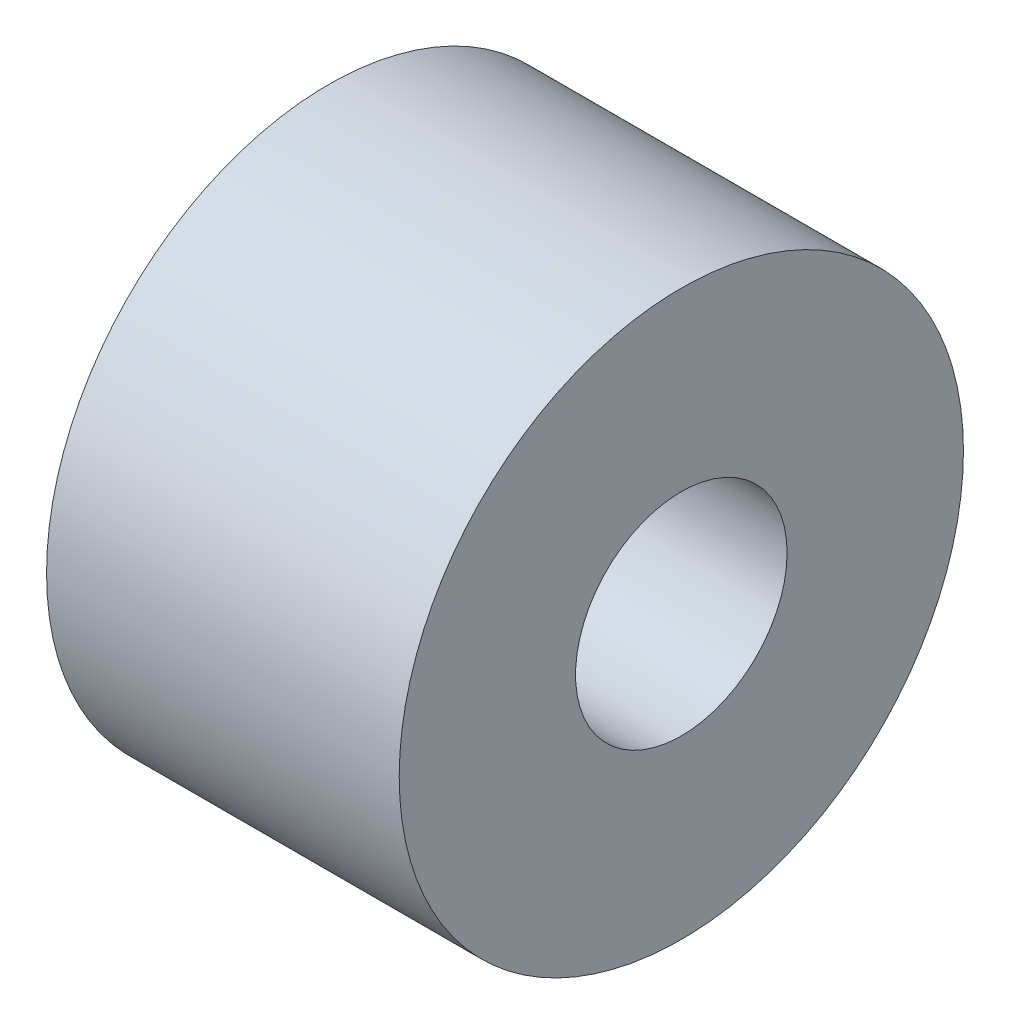
ISO-10303-21;
HEADER;
FILE_DESCRIPTION(('STEP AP214'),'2;1');
FILE_NAME('part.step','',(''),(''),'','','');
FILE_SCHEMA(('AUTOMOTIVE_DESIGN { 1 0 10303 214 1 1 1 1 }'));
ENDSEC;
DATA;
#1=APPLICATION_CONTEXT('core data for automotive mechanical design processes');
#2=APPLICATION_PROTOCOL_DEFINITION('international standard','automotive_design',2000,#1);
#3=PRODUCT_CONTEXT('',#1,'mechanical');
#4=PRODUCT('Part','Part','',(#3));
#5=PRODUCT_RELATED_PRODUCT_CATEGORY('part','',(#4));
#6=PRODUCT_DEFINITION_FORMATION('','',#4);
#7=PRODUCT_DEFINITION_CONTEXT('part definition',#1,'design');
#8=PRODUCT_DEFINITION('design','',#6,#7);
#9=PRODUCT_DEFINITION_SHAPE('','',#8);
#10=(LENGTH_UNIT() NAMED_UNIT(*) SI_UNIT(.MILLI.,.METRE.));
#11=(NAMED_UNIT(*) PLANE_ANGLE_UNIT() SI_UNIT($,.RADIAN.));
#12=(NAMED_UNIT(*) SI_UNIT($,.STERADIAN.) SOLID_ANGLE_UNIT());
#13=UNCERTAINTY_MEASURE_WITH_UNIT(LENGTH_MEASURE(1.E-05),#10,'distance_accuracy_value','');
#14=(GEOMETRIC_REPRESENTATION_CONTEXT(3) GLOBAL_UNCERTAINTY_ASSIGNED_CONTEXT((#13)) GLOBAL_UNIT_ASSIGNED_CONTEXT((#10,
#11,#12)) REPRESENTATION_CONTEXT('',''));
#15=CARTESIAN_POINT('',(0.,0.,0.));
#16=DIRECTION('',(0.,0.,1.));
#17=DIRECTION('',(1.,0.,0.));
#18=AXIS2_PLACEMENT_3D('',#15,#16,#17);
#19=CARTESIAN_POINT('',(25.,0.,0.));
#20=DIRECTION('',(1.,0.,0.));
#21=DIRECTION('',(0.,0.,-1.));
#22=AXIS2_PLACEMENT_3D('',#19,#20,#21);
#23=PLANE('',#22);
#24=CARTESIAN_POINT('',(25.,0.,0.));
#25=DIRECTION('',(1.,0.,0.));
#26=DIRECTION('',(0.,0.,-1.));
#27=AXIS2_PLACEMENT_3D('',#24,#25,#26);
#28=CIRCLE('',#27,20.);
#29=CARTESIAN_POINT('',(25.,0.,-20.));
#30=VERTEX_POINT('',#29);
#31=EDGE_CURVE('E10',#30,#30,#28,.T.);
#32=ORIENTED_EDGE('',*,*,#31,.T.);
#33=EDGE_LOOP('',(#32));
#34=FACE_BOUND('',#33,.T.);
#35=CARTESIAN_POINT('',(25.,0.,0.));
#36=DIRECTION('',(1.,0.,0.));
#37=DIRECTION('',(0.,0.,-1.));
#38=AXIS2_PLACEMENT_3D('',#35,#36,#37);
#39=CIRCLE('',#38,7.5);
#40=CARTESIAN_POINT('',(25.,0.,-7.5));
#41=VERTEX_POINT('',#40);
#42=EDGE_CURVE('E46',#41,#41,#39,.T.);
#43=ORIENTED_EDGE('',*,*,#42,.F.);
#44=EDGE_LOOP('',(#43));
#45=FACE_BOUND('',#44,.T.);
#46=ADVANCED_FACE('F35',(#34,#45),#23,.T.);
#47=CARTESIAN_POINT('',(0.,0.,0.));
#48=DIRECTION('',(1.,0.,0.));
#49=DIRECTION('',(0.,0.,-1.));
#50=AXIS2_PLACEMENT_3D('',#47,#48,#49);
#51=PLANE('',#50);
#52=CARTESIAN_POINT('',(0.,0.,0.));
#53=DIRECTION('',(1.,0.,0.));
#54=DIRECTION('',(0.,0.,-1.));
#55=AXIS2_PLACEMENT_3D('',#52,#53,#54);
#56=CIRCLE('',#55,20.);
#57=CARTESIAN_POINT('',(0.,0.,-20.));
#58=VERTEX_POINT('',#57);
#59=EDGE_CURVE('E39',#58,#58,#56,.T.);
#60=ORIENTED_EDGE('',*,*,#59,.F.);
#61=EDGE_LOOP('',(#60));
#62=FACE_BOUND('',#61,.T.);
#63=CARTESIAN_POINT('',(0.,0.,0.));
#64=DIRECTION('',(1.,0.,0.));
#65=DIRECTION('',(0.,0.,-1.));
#66=AXIS2_PLACEMENT_3D('',#63,#64,#65);
#67=CIRCLE('',#66,7.5);
#68=CARTESIAN_POINT('',(0.,0.,-7.5));
#69=VERTEX_POINT('',#68);
#70=EDGE_CURVE('E48',#69,#69,#67,.T.);
#71=ORIENTED_EDGE('',*,*,#70,.T.);
#72=EDGE_LOOP('',(#71));
#73=FACE_BOUND('',#72,.T.);
#74=ADVANCED_FACE('F58',(#62,#73),#51,.F.);
#75=CARTESIAN_POINT('',(25.,0.,0.));
#76=DIRECTION('',(-1.,0.,0.));
#77=DIRECTION('',(0.,0.,1.));
#78=AXIS2_PLACEMENT_3D('',#75,#76,#77);
#79=CYLINDRICAL_SURFACE('',#78,20.);
#80=ORIENTED_EDGE('',*,*,#31,.F.);
#81=EDGE_LOOP('',(#80));
#82=FACE_BOUND('',#81,.T.);
#83=ORIENTED_EDGE('',*,*,#59,.T.);
#84=EDGE_LOOP('',(#83));
#85=FACE_BOUND('',#84,.T.);
#86=ADVANCED_FACE('F37',(#82,#85),#79,.T.);
#87=CARTESIAN_POINT('',(25.,0.,0.));
#88=DIRECTION('',(-1.,0.,0.));
#89=DIRECTION('',(0.,0.,1.));
#90=AXIS2_PLACEMENT_3D('',#87,#88,#89);
#91=CYLINDRICAL_SURFACE('',#90,7.5);
#92=ORIENTED_EDGE('',*,*,#42,.T.);
#93=EDGE_LOOP('',(#92));
#94=FACE_BOUND('',#93,.T.);
#95=ORIENTED_EDGE('',*,*,#70,.F.);
#96=EDGE_LOOP('',(#95));
#97=FACE_BOUND('',#96,.T.);
#98=ADVANCED_FACE('F54',(#94,#97),#91,.F.);
#99=CLOSED_SHELL('',(#46,#74,#86,#98));
#100=MANIFOLD_SOLID_BREP('B2',#99);
#101=ADVANCED_BREP_SHAPE_REPRESENTATION('',(#18,#100),#14);
#102=SHAPE_DEFINITION_REPRESENTATION(#9,#101);
ENDSEC;
END-ISO-10303-21;
